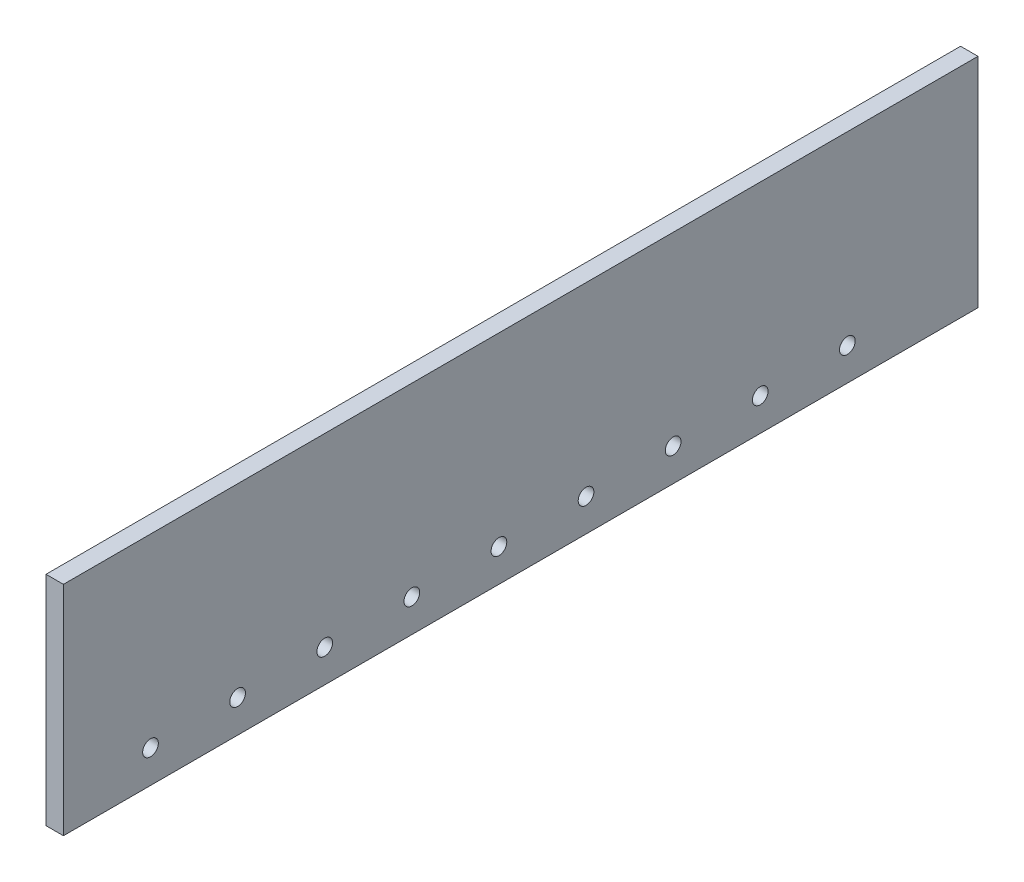
ISO-10303-21;
HEADER;
FILE_DESCRIPTION(('STEP AP214'),'2;1');
FILE_NAME('part.step','',(''),(''),'','','');
FILE_SCHEMA(('AUTOMOTIVE_DESIGN { 1 0 10303 214 1 1 1 1 }'));
ENDSEC;
DATA;
#1=APPLICATION_CONTEXT('core data for automotive mechanical design processes');
#2=APPLICATION_PROTOCOL_DEFINITION('international standard','automotive_design',2000,#1);
#3=PRODUCT_CONTEXT('',#1,'mechanical');
#4=PRODUCT('Part','Part','',(#3));
#5=PRODUCT_RELATED_PRODUCT_CATEGORY('part','',(#4));
#6=PRODUCT_DEFINITION_FORMATION('','',#4);
#7=PRODUCT_DEFINITION_CONTEXT('part definition',#1,'design');
#8=PRODUCT_DEFINITION('design','',#6,#7);
#9=PRODUCT_DEFINITION_SHAPE('','',#8);
#10=(LENGTH_UNIT() NAMED_UNIT(*) SI_UNIT(.MILLI.,.METRE.));
#11=(NAMED_UNIT(*) PLANE_ANGLE_UNIT() SI_UNIT($,.RADIAN.));
#12=(NAMED_UNIT(*) SI_UNIT($,.STERADIAN.) SOLID_ANGLE_UNIT());
#13=UNCERTAINTY_MEASURE_WITH_UNIT(LENGTH_MEASURE(1.E-05),#10,'distance_accuracy_value','');
#14=(GEOMETRIC_REPRESENTATION_CONTEXT(3) GLOBAL_UNCERTAINTY_ASSIGNED_CONTEXT((#13)) GLOBAL_UNIT_ASSIGNED_CONTEXT((#10,
#11,#12)) REPRESENTATION_CONTEXT('',''));
#15=CARTESIAN_POINT('',(0.,0.,0.));
#16=DIRECTION('',(0.,0.,1.));
#17=DIRECTION('',(1.,0.,0.));
#18=AXIS2_PLACEMENT_3D('',#15,#16,#17);
#19=CARTESIAN_POINT('',(4.,0.,0.));
#20=DIRECTION('',(1.,0.,0.));
#21=DIRECTION('',(0.,0.,-1.));
#22=AXIS2_PLACEMENT_3D('',#19,#20,#21);
#23=PLANE('',#22);
#24=CARTESIAN_POINT('',(4.,7.71604938271603,-75.7407407407407));
#25=DIRECTION('',(1.,0.,0.));
#26=DIRECTION('',(0.,0.,-1.));
#27=AXIS2_PLACEMENT_3D('',#24,#25,#26);
#28=CIRCLE('',#27,1.79999999999999);
#29=CARTESIAN_POINT('',(4.,7.71604938271603,-77.5407407407407));
#30=VERTEX_POINT('',#29);
#31=EDGE_CURVE('E151',#30,#30,#28,.T.);
#32=ORIENTED_EDGE('',*,*,#31,.F.);
#33=EDGE_LOOP('',(#32));
#34=FACE_BOUND('',#33,.T.);
#35=CARTESIAN_POINT('',(4.,7.71604938271603,-35.7407407407407));
#36=DIRECTION('',(1.,0.,0.));
#37=DIRECTION('',(0.,0.,-1.));
#38=AXIS2_PLACEMENT_3D('',#35,#36,#37);
#39=CIRCLE('',#38,1.79999999999999);
#40=CARTESIAN_POINT('',(4.,7.71604938271603,-37.5407407407407));
#41=VERTEX_POINT('',#40);
#42=EDGE_CURVE('E139',#41,#41,#39,.T.);
#43=ORIENTED_EDGE('',*,*,#42,.F.);
#44=EDGE_LOOP('',(#43));
#45=FACE_BOUND('',#44,.T.);
#46=CARTESIAN_POINT('',(4.,7.71604938271603,4.25925925925934));
#47=DIRECTION('',(1.,0.,0.));
#48=DIRECTION('',(0.,0.,-1.));
#49=AXIS2_PLACEMENT_3D('',#46,#47,#48);
#50=CIRCLE('',#49,1.79999999999999);
#51=CARTESIAN_POINT('',(4.,7.71604938271603,2.45925925925934));
#52=VERTEX_POINT('',#51);
#53=EDGE_CURVE('E127',#52,#52,#50,.T.);
#54=ORIENTED_EDGE('',*,*,#53,.F.);
#55=EDGE_LOOP('',(#54));
#56=FACE_BOUND('',#55,.T.);
#57=CARTESIAN_POINT('',(4.,7.71604938271603,44.2592592592593));
#58=DIRECTION('',(1.,0.,0.));
#59=DIRECTION('',(0.,0.,-1.));
#60=AXIS2_PLACEMENT_3D('',#57,#58,#59);
#61=CIRCLE('',#60,1.79999999999999);
#62=CARTESIAN_POINT('',(4.,7.71604938271603,42.4592592592593));
#63=VERTEX_POINT('',#62);
#64=EDGE_CURVE('E115',#63,#63,#61,.T.);
#65=ORIENTED_EDGE('',*,*,#64,.F.);
#66=EDGE_LOOP('',(#65));
#67=FACE_BOUND('',#66,.T.);
#68=DIRECTION('',(0.,-1.,0.));
#69=VECTOR('',#68,1.);
#70=CARTESIAN_POINT('',(4.,50.216049382716,84.2592592592593));
#71=LINE('',#70,#69);
#72=CARTESIAN_POINT('',(4.,50.216049382716,84.2592592592593));
#73=VERTEX_POINT('',#72);
#74=CARTESIAN_POINT('',(4.,0.216049382716025,84.2592592592593));
#75=VERTEX_POINT('',#74);
#76=EDGE_CURVE('E85',#73,#75,#71,.T.);
#77=ORIENTED_EDGE('',*,*,#76,.T.);
#78=DIRECTION('',(0.,0.,-1.));
#79=VECTOR('',#78,1.);
#80=CARTESIAN_POINT('',(4.,0.216049382716025,84.2592592592593));
#81=LINE('',#80,#79);
#82=CARTESIAN_POINT('',(4.,0.216049382716025,-125.740740740741));
#83=VERTEX_POINT('',#82);
#84=EDGE_CURVE('E80',#75,#83,#81,.T.);
#85=ORIENTED_EDGE('',*,*,#84,.T.);
#86=DIRECTION('',(0.,1.,0.));
#87=VECTOR('',#86,1.);
#88=CARTESIAN_POINT('',(4.,50.216049382716,-125.740740740741));
#89=LINE('',#88,#87);
#90=CARTESIAN_POINT('',(4.,50.216049382716,-125.740740740741));
#91=VERTEX_POINT('',#90);
#92=EDGE_CURVE('E83',#83,#91,#89,.T.);
#93=ORIENTED_EDGE('',*,*,#92,.T.);
#94=DIRECTION('',(0.,0.,1.));
#95=VECTOR('',#94,1.);
#96=CARTESIAN_POINT('',(4.,50.216049382716,84.2592592592593));
#97=LINE('',#96,#95);
#98=EDGE_CURVE('E50',#91,#73,#97,.T.);
#99=ORIENTED_EDGE('',*,*,#98,.T.);
#100=EDGE_LOOP('',(#77,#85,#93,#99));
#101=FACE_BOUND('',#100,.T.);
#102=CARTESIAN_POINT('',(4.,7.71604938271603,64.2592592592593));
#103=DIRECTION('',(1.,0.,0.));
#104=DIRECTION('',(0.,0.,-1.));
#105=AXIS2_PLACEMENT_3D('',#102,#103,#104);
#106=CIRCLE('',#105,1.79999999999999);
#107=CARTESIAN_POINT('',(4.,7.71604938271603,62.4592592592593));
#108=VERTEX_POINT('',#107);
#109=EDGE_CURVE('E100',#108,#108,#106,.T.);
#110=ORIENTED_EDGE('',*,*,#109,.F.);
#111=EDGE_LOOP('',(#110));
#112=FACE_BOUND('',#111,.T.);
#113=CARTESIAN_POINT('',(4.,7.71604938271603,24.2592592592593));
#114=DIRECTION('',(1.,0.,0.));
#115=DIRECTION('',(0.,0.,-1.));
#116=AXIS2_PLACEMENT_3D('',#113,#114,#115);
#117=CIRCLE('',#116,1.79999999999999);
#118=CARTESIAN_POINT('',(4.,7.71604938271603,22.4592592592593));
#119=VERTEX_POINT('',#118);
#120=EDGE_CURVE('E121',#119,#119,#117,.T.);
#121=ORIENTED_EDGE('',*,*,#120,.F.);
#122=EDGE_LOOP('',(#121));
#123=FACE_BOUND('',#122,.T.);
#124=CARTESIAN_POINT('',(4.,7.71604938271603,-15.7407407407407));
#125=DIRECTION('',(1.,0.,0.));
#126=DIRECTION('',(0.,0.,-1.));
#127=AXIS2_PLACEMENT_3D('',#124,#125,#126);
#128=CIRCLE('',#127,1.79999999999999);
#129=CARTESIAN_POINT('',(4.,7.71604938271603,-17.5407407407407));
#130=VERTEX_POINT('',#129);
#131=EDGE_CURVE('E133',#130,#130,#128,.T.);
#132=ORIENTED_EDGE('',*,*,#131,.F.);
#133=EDGE_LOOP('',(#132));
#134=FACE_BOUND('',#133,.T.);
#135=CARTESIAN_POINT('',(4.,7.71604938271603,-55.7407407407407));
#136=DIRECTION('',(1.,0.,0.));
#137=DIRECTION('',(0.,0.,-1.));
#138=AXIS2_PLACEMENT_3D('',#135,#136,#137);
#139=CIRCLE('',#138,1.79999999999999);
#140=CARTESIAN_POINT('',(4.,7.71604938271603,-57.5407407407407));
#141=VERTEX_POINT('',#140);
#142=EDGE_CURVE('E145',#141,#141,#139,.T.);
#143=ORIENTED_EDGE('',*,*,#142,.F.);
#144=EDGE_LOOP('',(#143));
#145=FACE_BOUND('',#144,.T.);
#146=CARTESIAN_POINT('',(4.,7.71604938271603,-95.7407407407407));
#147=DIRECTION('',(1.,0.,0.));
#148=DIRECTION('',(0.,0.,-1.));
#149=AXIS2_PLACEMENT_3D('',#146,#147,#148);
#150=CIRCLE('',#149,1.79999999999999);
#151=CARTESIAN_POINT('',(4.,7.71604938271603,-97.5407407407407));
#152=VERTEX_POINT('',#151);
#153=EDGE_CURVE('E157',#152,#152,#150,.T.);
#154=ORIENTED_EDGE('',*,*,#153,.F.);
#155=EDGE_LOOP('',(#154));
#156=FACE_BOUND('',#155,.T.);
#157=ADVANCED_FACE('F33',(#34,#45,#56,#67,#101,#112,#123,#134,#145,#156),#23,.T.);
#158=CARTESIAN_POINT('',(0.,0.,0.));
#159=DIRECTION('',(1.,0.,0.));
#160=DIRECTION('',(0.,0.,-1.));
#161=AXIS2_PLACEMENT_3D('',#158,#159,#160);
#162=PLANE('',#161);
#163=DIRECTION('',(0.,-1.,0.));
#164=VECTOR('',#163,1.);
#165=CARTESIAN_POINT('',(0.,50.216049382716,84.2592592592593));
#166=LINE('',#165,#164);
#167=CARTESIAN_POINT('',(0.,50.216049382716,84.2592592592593));
#168=VERTEX_POINT('',#167);
#169=CARTESIAN_POINT('',(0.,0.216049382716025,84.2592592592593));
#170=VERTEX_POINT('',#169);
#171=EDGE_CURVE('E97',#168,#170,#166,.T.);
#172=ORIENTED_EDGE('',*,*,#171,.F.);
#173=DIRECTION('',(0.,0.,1.));
#174=VECTOR('',#173,1.);
#175=CARTESIAN_POINT('',(0.,50.216049382716,84.2592592592593));
#176=LINE('',#175,#174);
#177=CARTESIAN_POINT('',(0.,50.216049382716,-125.740740740741));
#178=VERTEX_POINT('',#177);
#179=EDGE_CURVE('E73',#178,#168,#176,.T.);
#180=ORIENTED_EDGE('',*,*,#179,.F.);
#181=DIRECTION('',(0.,1.,0.));
#182=VECTOR('',#181,1.);
#183=CARTESIAN_POINT('',(0.,50.216049382716,-125.740740740741));
#184=LINE('',#183,#182);
#185=CARTESIAN_POINT('',(0.,0.216049382716025,-125.740740740741));
#186=VERTEX_POINT('',#185);
#187=EDGE_CURVE('E67',#186,#178,#184,.T.);
#188=ORIENTED_EDGE('',*,*,#187,.F.);
#189=DIRECTION('',(0.,0.,-1.));
#190=VECTOR('',#189,1.);
#191=CARTESIAN_POINT('',(0.,0.216049382716025,84.2592592592593));
#192=LINE('',#191,#190);
#193=EDGE_CURVE('E89',#170,#186,#192,.T.);
#194=ORIENTED_EDGE('',*,*,#193,.F.);
#195=EDGE_LOOP('',(#172,#180,#188,#194));
#196=FACE_BOUND('',#195,.T.);
#197=CARTESIAN_POINT('',(0.,7.71604938271603,64.2592592592593));
#198=DIRECTION('',(1.,0.,0.));
#199=DIRECTION('',(0.,0.,-1.));
#200=AXIS2_PLACEMENT_3D('',#197,#198,#199);
#201=CIRCLE('',#200,1.79999999999999);
#202=CARTESIAN_POINT('',(0.,7.71604938271603,62.4592592592593));
#203=VERTEX_POINT('',#202);
#204=EDGE_CURVE('E112',#203,#203,#201,.T.);
#205=ORIENTED_EDGE('',*,*,#204,.T.);
#206=EDGE_LOOP('',(#205));
#207=FACE_BOUND('',#206,.T.);
#208=CARTESIAN_POINT('',(0.,7.71604938271603,44.2592592592593));
#209=DIRECTION('',(1.,0.,0.));
#210=DIRECTION('',(0.,0.,-1.));
#211=AXIS2_PLACEMENT_3D('',#208,#209,#210);
#212=CIRCLE('',#211,1.79999999999999);
#213=CARTESIAN_POINT('',(0.,7.71604938271603,42.4592592592593));
#214=VERTEX_POINT('',#213);
#215=EDGE_CURVE('E118',#214,#214,#212,.T.);
#216=ORIENTED_EDGE('',*,*,#215,.T.);
#217=EDGE_LOOP('',(#216));
#218=FACE_BOUND('',#217,.T.);
#219=CARTESIAN_POINT('',(0.,7.71604938271603,24.2592592592593));
#220=DIRECTION('',(1.,0.,0.));
#221=DIRECTION('',(0.,0.,-1.));
#222=AXIS2_PLACEMENT_3D('',#219,#220,#221);
#223=CIRCLE('',#222,1.79999999999999);
#224=CARTESIAN_POINT('',(0.,7.71604938271603,22.4592592592593));
#225=VERTEX_POINT('',#224);
#226=EDGE_CURVE('E124',#225,#225,#223,.T.);
#227=ORIENTED_EDGE('',*,*,#226,.T.);
#228=EDGE_LOOP('',(#227));
#229=FACE_BOUND('',#228,.T.);
#230=CARTESIAN_POINT('',(0.,7.71604938271603,4.25925925925934));
#231=DIRECTION('',(1.,0.,0.));
#232=DIRECTION('',(0.,0.,-1.));
#233=AXIS2_PLACEMENT_3D('',#230,#231,#232);
#234=CIRCLE('',#233,1.79999999999999);
#235=CARTESIAN_POINT('',(0.,7.71604938271603,2.45925925925934));
#236=VERTEX_POINT('',#235);
#237=EDGE_CURVE('E130',#236,#236,#234,.T.);
#238=ORIENTED_EDGE('',*,*,#237,.T.);
#239=EDGE_LOOP('',(#238));
#240=FACE_BOUND('',#239,.T.);
#241=CARTESIAN_POINT('',(0.,7.71604938271603,-15.7407407407407));
#242=DIRECTION('',(1.,0.,0.));
#243=DIRECTION('',(0.,0.,-1.));
#244=AXIS2_PLACEMENT_3D('',#241,#242,#243);
#245=CIRCLE('',#244,1.79999999999999);
#246=CARTESIAN_POINT('',(0.,7.71604938271603,-17.5407407407407));
#247=VERTEX_POINT('',#246);
#248=EDGE_CURVE('E136',#247,#247,#245,.T.);
#249=ORIENTED_EDGE('',*,*,#248,.T.);
#250=EDGE_LOOP('',(#249));
#251=FACE_BOUND('',#250,.T.);
#252=CARTESIAN_POINT('',(0.,7.71604938271603,-35.7407407407407));
#253=DIRECTION('',(1.,0.,0.));
#254=DIRECTION('',(0.,0.,-1.));
#255=AXIS2_PLACEMENT_3D('',#252,#253,#254);
#256=CIRCLE('',#255,1.79999999999999);
#257=CARTESIAN_POINT('',(0.,7.71604938271603,-37.5407407407407));
#258=VERTEX_POINT('',#257);
#259=EDGE_CURVE('E142',#258,#258,#256,.T.);
#260=ORIENTED_EDGE('',*,*,#259,.T.);
#261=EDGE_LOOP('',(#260));
#262=FACE_BOUND('',#261,.T.);
#263=CARTESIAN_POINT('',(0.,7.71604938271603,-55.7407407407407));
#264=DIRECTION('',(1.,0.,0.));
#265=DIRECTION('',(0.,0.,-1.));
#266=AXIS2_PLACEMENT_3D('',#263,#264,#265);
#267=CIRCLE('',#266,1.79999999999999);
#268=CARTESIAN_POINT('',(0.,7.71604938271603,-57.5407407407407));
#269=VERTEX_POINT('',#268);
#270=EDGE_CURVE('E148',#269,#269,#267,.T.);
#271=ORIENTED_EDGE('',*,*,#270,.T.);
#272=EDGE_LOOP('',(#271));
#273=FACE_BOUND('',#272,.T.);
#274=CARTESIAN_POINT('',(0.,7.71604938271603,-75.7407407407407));
#275=DIRECTION('',(1.,0.,0.));
#276=DIRECTION('',(0.,0.,-1.));
#277=AXIS2_PLACEMENT_3D('',#274,#275,#276);
#278=CIRCLE('',#277,1.79999999999999);
#279=CARTESIAN_POINT('',(0.,7.71604938271603,-77.5407407407407));
#280=VERTEX_POINT('',#279);
#281=EDGE_CURVE('E154',#280,#280,#278,.T.);
#282=ORIENTED_EDGE('',*,*,#281,.T.);
#283=EDGE_LOOP('',(#282));
#284=FACE_BOUND('',#283,.T.);
#285=CARTESIAN_POINT('',(0.,7.71604938271603,-95.7407407407407));
#286=DIRECTION('',(1.,0.,0.));
#287=DIRECTION('',(0.,0.,-1.));
#288=AXIS2_PLACEMENT_3D('',#285,#286,#287);
#289=CIRCLE('',#288,1.79999999999999);
#290=CARTESIAN_POINT('',(0.,7.71604938271603,-97.5407407407407));
#291=VERTEX_POINT('',#290);
#292=EDGE_CURVE('E160',#291,#291,#289,.T.);
#293=ORIENTED_EDGE('',*,*,#292,.T.);
#294=EDGE_LOOP('',(#293));
#295=FACE_BOUND('',#294,.T.);
#296=ADVANCED_FACE('F108',(#196,#207,#218,#229,#240,#251,#262,#273,#284,#295),#162,.F.);
#297=CARTESIAN_POINT('',(4.,50.216049382716,84.2592592592593));
#298=DIRECTION('',(0.,0.,-1.));
#299=DIRECTION('',(-1.,0.,0.));
#300=AXIS2_PLACEMENT_3D('',#297,#298,#299);
#301=PLANE('',#300);
#302=ORIENTED_EDGE('',*,*,#171,.T.);
#303=DIRECTION('',(-1.,0.,0.));
#304=VECTOR('',#303,1.);
#305=CARTESIAN_POINT('',(4.,0.216049382716025,84.2592592592593));
#306=LINE('',#305,#304);
#307=EDGE_CURVE('E11',#75,#170,#306,.T.);
#308=ORIENTED_EDGE('',*,*,#307,.F.);
#309=ORIENTED_EDGE('',*,*,#76,.F.);
#310=DIRECTION('',(-1.,0.,0.));
#311=VECTOR('',#310,1.);
#312=CARTESIAN_POINT('',(4.,50.216049382716,84.2592592592593));
#313=LINE('',#312,#311);
#314=EDGE_CURVE('E93',#73,#168,#313,.T.);
#315=ORIENTED_EDGE('',*,*,#314,.T.);
#316=EDGE_LOOP('',(#302,#308,#309,#315));
#317=FACE_BOUND('',#316,.T.);
#318=ADVANCED_FACE('F35',(#317),#301,.F.);
#319=CARTESIAN_POINT('',(4.,0.216049382716025,84.2592592592593));
#320=DIRECTION('',(0.,1.,0.));
#321=DIRECTION('',(0.,0.,1.));
#322=AXIS2_PLACEMENT_3D('',#319,#320,#321);
#323=PLANE('',#322);
#324=ORIENTED_EDGE('',*,*,#193,.T.);
#325=DIRECTION('',(-1.,0.,0.));
#326=VECTOR('',#325,1.);
#327=CARTESIAN_POINT('',(4.,0.216049382716025,-125.740740740741));
#328=LINE('',#327,#326);
#329=EDGE_CURVE('E42',#83,#186,#328,.T.);
#330=ORIENTED_EDGE('',*,*,#329,.F.);
#331=ORIENTED_EDGE('',*,*,#84,.F.);
#332=ORIENTED_EDGE('',*,*,#307,.T.);
#333=EDGE_LOOP('',(#324,#330,#331,#332));
#334=FACE_BOUND('',#333,.T.);
#335=ADVANCED_FACE('F88',(#334),#323,.F.);
#336=CARTESIAN_POINT('',(4.,50.216049382716,-125.740740740741));
#337=DIRECTION('',(0.,0.,1.));
#338=DIRECTION('',(1.,0.,0.));
#339=AXIS2_PLACEMENT_3D('',#336,#337,#338);
#340=PLANE('',#339);
#341=ORIENTED_EDGE('',*,*,#187,.T.);
#342=DIRECTION('',(-1.,0.,0.));
#343=VECTOR('',#342,1.);
#344=CARTESIAN_POINT('',(4.,50.216049382716,-125.740740740741));
#345=LINE('',#344,#343);
#346=EDGE_CURVE('E90',#91,#178,#345,.T.);
#347=ORIENTED_EDGE('',*,*,#346,.F.);
#348=ORIENTED_EDGE('',*,*,#92,.F.);
#349=ORIENTED_EDGE('',*,*,#329,.T.);
#350=EDGE_LOOP('',(#341,#347,#348,#349));
#351=FACE_BOUND('',#350,.T.);
#352=ADVANCED_FACE('F91',(#351),#340,.F.);
#353=CARTESIAN_POINT('',(4.,50.216049382716,84.2592592592593));
#354=DIRECTION('',(0.,-1.,0.));
#355=DIRECTION('',(0.,0.,-1.));
#356=AXIS2_PLACEMENT_3D('',#353,#354,#355);
#357=PLANE('',#356);
#358=ORIENTED_EDGE('',*,*,#179,.T.);
#359=ORIENTED_EDGE('',*,*,#314,.F.);
#360=ORIENTED_EDGE('',*,*,#98,.F.);
#361=ORIENTED_EDGE('',*,*,#346,.T.);
#362=EDGE_LOOP('',(#358,#359,#360,#361));
#363=FACE_BOUND('',#362,.T.);
#364=ADVANCED_FACE('F105',(#363),#357,.F.);
#365=CARTESIAN_POINT('',(4.,7.71604938271603,64.2592592592593));
#366=DIRECTION('',(-1.,0.,0.));
#367=DIRECTION('',(0.,0.,1.));
#368=AXIS2_PLACEMENT_3D('',#365,#366,#367);
#369=CYLINDRICAL_SURFACE('',#368,1.79999999999999);
#370=ORIENTED_EDGE('',*,*,#109,.T.);
#371=EDGE_LOOP('',(#370));
#372=FACE_BOUND('',#371,.T.);
#373=ORIENTED_EDGE('',*,*,#204,.F.);
#374=EDGE_LOOP('',(#373));
#375=FACE_BOUND('',#374,.T.);
#376=ADVANCED_FACE('F179',(#372,#375),#369,.F.);
#377=CARTESIAN_POINT('',(4.,7.71604938271603,44.2592592592593));
#378=DIRECTION('',(-1.,0.,0.));
#379=DIRECTION('',(0.,0.,1.));
#380=AXIS2_PLACEMENT_3D('',#377,#378,#379);
#381=CYLINDRICAL_SURFACE('',#380,1.79999999999999);
#382=ORIENTED_EDGE('',*,*,#64,.T.);
#383=EDGE_LOOP('',(#382));
#384=FACE_BOUND('',#383,.T.);
#385=ORIENTED_EDGE('',*,*,#215,.F.);
#386=EDGE_LOOP('',(#385));
#387=FACE_BOUND('',#386,.T.);
#388=ADVANCED_FACE('F225',(#384,#387),#381,.F.);
#389=CARTESIAN_POINT('',(4.,7.71604938271603,24.2592592592593));
#390=DIRECTION('',(-1.,0.,0.));
#391=DIRECTION('',(0.,0.,1.));
#392=AXIS2_PLACEMENT_3D('',#389,#390,#391);
#393=CYLINDRICAL_SURFACE('',#392,1.79999999999999);
#394=ORIENTED_EDGE('',*,*,#120,.T.);
#395=EDGE_LOOP('',(#394));
#396=FACE_BOUND('',#395,.T.);
#397=ORIENTED_EDGE('',*,*,#226,.F.);
#398=EDGE_LOOP('',(#397));
#399=FACE_BOUND('',#398,.T.);
#400=ADVANCED_FACE('F233',(#396,#399),#393,.F.);
#401=CARTESIAN_POINT('',(4.,7.71604938271603,4.25925925925934));
#402=DIRECTION('',(-1.,0.,0.));
#403=DIRECTION('',(0.,0.,1.));
#404=AXIS2_PLACEMENT_3D('',#401,#402,#403);
#405=CYLINDRICAL_SURFACE('',#404,1.79999999999999);
#406=ORIENTED_EDGE('',*,*,#53,.T.);
#407=EDGE_LOOP('',(#406));
#408=FACE_BOUND('',#407,.T.);
#409=ORIENTED_EDGE('',*,*,#237,.F.);
#410=EDGE_LOOP('',(#409));
#411=FACE_BOUND('',#410,.T.);
#412=ADVANCED_FACE('F241',(#408,#411),#405,.F.);
#413=CARTESIAN_POINT('',(4.,7.71604938271603,-15.7407407407407));
#414=DIRECTION('',(-1.,0.,0.));
#415=DIRECTION('',(0.,0.,1.));
#416=AXIS2_PLACEMENT_3D('',#413,#414,#415);
#417=CYLINDRICAL_SURFACE('',#416,1.79999999999999);
#418=ORIENTED_EDGE('',*,*,#131,.T.);
#419=EDGE_LOOP('',(#418));
#420=FACE_BOUND('',#419,.T.);
#421=ORIENTED_EDGE('',*,*,#248,.F.);
#422=EDGE_LOOP('',(#421));
#423=FACE_BOUND('',#422,.T.);
#424=ADVANCED_FACE('F250',(#420,#423),#417,.F.);
#425=CARTESIAN_POINT('',(4.,7.71604938271603,-35.7407407407407));
#426=DIRECTION('',(-1.,0.,0.));
#427=DIRECTION('',(0.,0.,1.));
#428=AXIS2_PLACEMENT_3D('',#425,#426,#427);
#429=CYLINDRICAL_SURFACE('',#428,1.79999999999999);
#430=ORIENTED_EDGE('',*,*,#42,.T.);
#431=EDGE_LOOP('',(#430));
#432=FACE_BOUND('',#431,.T.);
#433=ORIENTED_EDGE('',*,*,#259,.F.);
#434=EDGE_LOOP('',(#433));
#435=FACE_BOUND('',#434,.T.);
#436=ADVANCED_FACE('F259',(#432,#435),#429,.F.);
#437=CARTESIAN_POINT('',(4.,7.71604938271603,-55.7407407407407));
#438=DIRECTION('',(-1.,0.,0.));
#439=DIRECTION('',(0.,0.,1.));
#440=AXIS2_PLACEMENT_3D('',#437,#438,#439);
#441=CYLINDRICAL_SURFACE('',#440,1.79999999999999);
#442=ORIENTED_EDGE('',*,*,#142,.T.);
#443=EDGE_LOOP('',(#442));
#444=FACE_BOUND('',#443,.T.);
#445=ORIENTED_EDGE('',*,*,#270,.F.);
#446=EDGE_LOOP('',(#445));
#447=FACE_BOUND('',#446,.T.);
#448=ADVANCED_FACE('F268',(#444,#447),#441,.F.);
#449=CARTESIAN_POINT('',(4.,7.71604938271603,-75.7407407407407));
#450=DIRECTION('',(-1.,0.,0.));
#451=DIRECTION('',(0.,0.,1.));
#452=AXIS2_PLACEMENT_3D('',#449,#450,#451);
#453=CYLINDRICAL_SURFACE('',#452,1.79999999999999);
#454=ORIENTED_EDGE('',*,*,#31,.T.);
#455=EDGE_LOOP('',(#454));
#456=FACE_BOUND('',#455,.T.);
#457=ORIENTED_EDGE('',*,*,#281,.F.);
#458=EDGE_LOOP('',(#457));
#459=FACE_BOUND('',#458,.T.);
#460=ADVANCED_FACE('F277',(#456,#459),#453,.F.);
#461=CARTESIAN_POINT('',(4.,7.71604938271603,-95.7407407407407));
#462=DIRECTION('',(-1.,0.,0.));
#463=DIRECTION('',(0.,0.,1.));
#464=AXIS2_PLACEMENT_3D('',#461,#462,#463);
#465=CYLINDRICAL_SURFACE('',#464,1.79999999999999);
#466=ORIENTED_EDGE('',*,*,#153,.T.);
#467=EDGE_LOOP('',(#466));
#468=FACE_BOUND('',#467,.T.);
#469=ORIENTED_EDGE('',*,*,#292,.F.);
#470=EDGE_LOOP('',(#469));
#471=FACE_BOUND('',#470,.T.);
#472=ADVANCED_FACE('F166',(#468,#471),#465,.F.);
#473=CLOSED_SHELL('',(#157,#296,#318,#335,#352,#364,#376,#388,#400,#412,#424,#436,#448,#460,#472));
#474=MANIFOLD_SOLID_BREP('B2',#473);
#475=ADVANCED_BREP_SHAPE_REPRESENTATION('',(#18,#474),#14);
#476=SHAPE_DEFINITION_REPRESENTATION(#9,#475);
ENDSEC;
END-ISO-10303-21;
